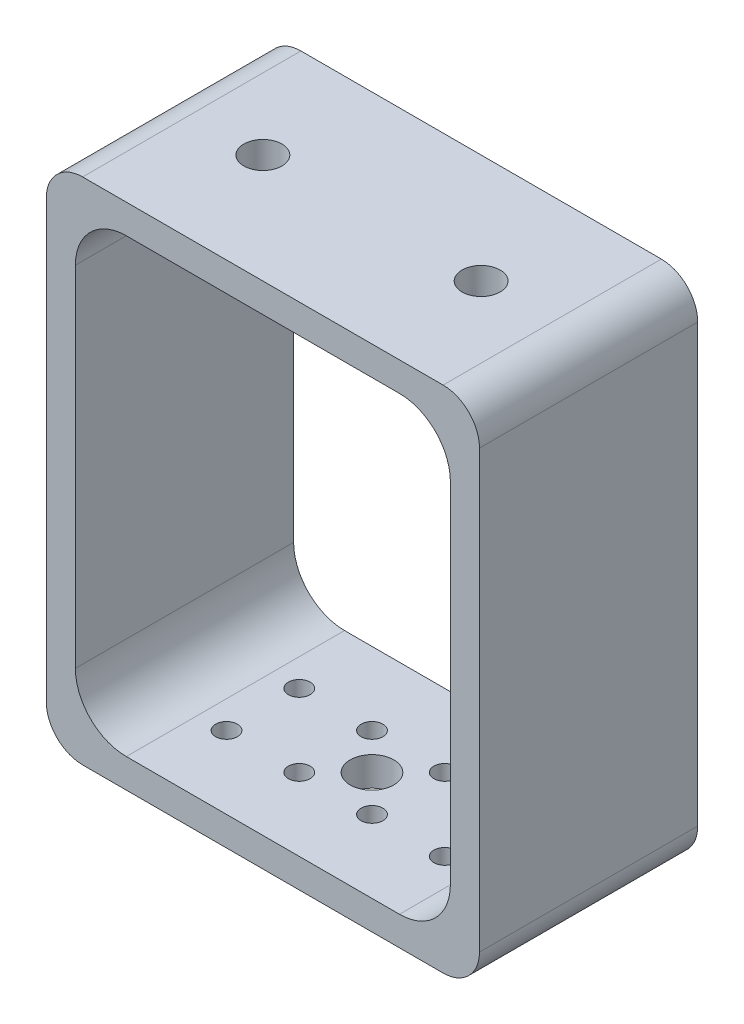
ISO-10303-21;
HEADER;
FILE_DESCRIPTION(('STEP AP214'),'2;1');
FILE_NAME('part.step','',(''),(''),'','','');
FILE_SCHEMA(('AUTOMOTIVE_DESIGN { 1 0 10303 214 1 1 1 1 }'));
ENDSEC;
DATA;
#1=APPLICATION_CONTEXT('core data for automotive mechanical design processes');
#2=APPLICATION_PROTOCOL_DEFINITION('international standard','automotive_design',2000,#1);
#3=PRODUCT_CONTEXT('',#1,'mechanical');
#4=PRODUCT('Part','Part','',(#3));
#5=PRODUCT_RELATED_PRODUCT_CATEGORY('part','',(#4));
#6=PRODUCT_DEFINITION_FORMATION('','',#4);
#7=PRODUCT_DEFINITION_CONTEXT('part definition',#1,'design');
#8=PRODUCT_DEFINITION('design','',#6,#7);
#9=PRODUCT_DEFINITION_SHAPE('','',#8);
#10=(LENGTH_UNIT() NAMED_UNIT(*) SI_UNIT(.MILLI.,.METRE.));
#11=(NAMED_UNIT(*) PLANE_ANGLE_UNIT() SI_UNIT($,.RADIAN.));
#12=(NAMED_UNIT(*) SI_UNIT($,.STERADIAN.) SOLID_ANGLE_UNIT());
#13=UNCERTAINTY_MEASURE_WITH_UNIT(LENGTH_MEASURE(1.E-05),#10,'distance_accuracy_value','');
#14=(GEOMETRIC_REPRESENTATION_CONTEXT(3) GLOBAL_UNCERTAINTY_ASSIGNED_CONTEXT((#13)) GLOBAL_UNIT_ASSIGNED_CONTEXT((#10,
#11,#12)) REPRESENTATION_CONTEXT('',''));
#15=CARTESIAN_POINT('',(0.,0.,0.));
#16=DIRECTION('',(0.,0.,1.));
#17=DIRECTION('',(1.,0.,0.));
#18=AXIS2_PLACEMENT_3D('',#15,#16,#17);
#19=CARTESIAN_POINT('',(0.,0.,15.));
#20=DIRECTION('',(0.,0.,1.));
#21=DIRECTION('',(1.,0.,0.));
#22=AXIS2_PLACEMENT_3D('',#19,#20,#21);
#23=PLANE('',#22);
#24=DIRECTION('',(0.,-1.,0.));
#25=VECTOR('',#24,1.);
#26=CARTESIAN_POINT('',(-29.7740385147519,0.,15.));
#27=LINE('',#26,#25);
#28=CARTESIAN_POINT('',(-29.7740385147519,65.,15.));
#29=VERTEX_POINT('',#28);
#30=CARTESIAN_POINT('',(-29.7740385147519,4.99999999999999,15.));
#31=VERTEX_POINT('',#30);
#32=EDGE_CURVE('E203',#29,#31,#27,.T.);
#33=ORIENTED_EDGE('',*,*,#32,.T.);
#34=CARTESIAN_POINT('',(-24.7740385147519,4.99999999999999,15.));
#35=DIRECTION('',(0.,0.,1.));
#36=DIRECTION('',(1.,0.,0.));
#37=AXIS2_PLACEMENT_3D('',#34,#35,#36);
#38=CIRCLE('',#37,5.);
#39=CARTESIAN_POINT('',(-24.7740385147519,0.,15.));
#40=VERTEX_POINT('',#39);
#41=EDGE_CURVE('E262',#31,#40,#38,.T.);
#42=ORIENTED_EDGE('',*,*,#41,.T.);
#43=DIRECTION('',(1.,0.,0.));
#44=VECTOR('',#43,1.);
#45=CARTESIAN_POINT('',(-29.7740385147519,0.,15.));
#46=LINE('',#45,#44);
#47=CARTESIAN_POINT('',(24.7740385147519,0.,15.));
#48=VERTEX_POINT('',#47);
#49=EDGE_CURVE('E291',#40,#48,#46,.T.);
#50=ORIENTED_EDGE('',*,*,#49,.T.);
#51=CARTESIAN_POINT('',(24.7740385147519,5.,15.));
#52=DIRECTION('',(0.,0.,1.));
#53=DIRECTION('',(1.,0.,0.));
#54=AXIS2_PLACEMENT_3D('',#51,#52,#53);
#55=CIRCLE('',#54,5.);
#56=CARTESIAN_POINT('',(29.7740385147519,5.,15.));
#57=VERTEX_POINT('',#56);
#58=EDGE_CURVE('E260',#48,#57,#55,.T.);
#59=ORIENTED_EDGE('',*,*,#58,.T.);
#60=DIRECTION('',(0.,1.,0.));
#61=VECTOR('',#60,1.);
#62=CARTESIAN_POINT('',(29.7740385147519,0.,15.));
#63=LINE('',#62,#61);
#64=CARTESIAN_POINT('',(29.7740385147519,65.,15.));
#65=VERTEX_POINT('',#64);
#66=EDGE_CURVE('E276',#57,#65,#63,.T.);
#67=ORIENTED_EDGE('',*,*,#66,.T.);
#68=CARTESIAN_POINT('',(24.7740385147519,65.,15.));
#69=DIRECTION('',(0.,0.,1.));
#70=DIRECTION('',(1.,0.,0.));
#71=AXIS2_PLACEMENT_3D('',#68,#69,#70);
#72=CIRCLE('',#71,5.);
#73=CARTESIAN_POINT('',(24.7740385147519,70.,15.));
#74=VERTEX_POINT('',#73);
#75=EDGE_CURVE('E84',#65,#74,#72,.T.);
#76=ORIENTED_EDGE('',*,*,#75,.T.);
#77=DIRECTION('',(-1.,0.,0.));
#78=VECTOR('',#77,1.);
#79=CARTESIAN_POINT('',(29.7740385147519,70.,15.));
#80=LINE('',#79,#78);
#81=CARTESIAN_POINT('',(-24.7740385147519,70.,15.));
#82=VERTEX_POINT('',#81);
#83=EDGE_CURVE('E208',#74,#82,#80,.T.);
#84=ORIENTED_EDGE('',*,*,#83,.T.);
#85=CARTESIAN_POINT('',(-24.7740385147519,65.,15.));
#86=DIRECTION('',(0.,0.,1.));
#87=DIRECTION('',(1.,0.,0.));
#88=AXIS2_PLACEMENT_3D('',#85,#86,#87);
#89=CIRCLE('',#88,5.);
#90=EDGE_CURVE('E257',#82,#29,#89,.T.);
#91=ORIENTED_EDGE('',*,*,#90,.T.);
#92=EDGE_LOOP('',(#33,#42,#50,#59,#67,#76,#84,#91));
#93=FACE_BOUND('',#92,.T.);
#94=DIRECTION('',(0.,1.,0.));
#95=VECTOR('',#94,1.);
#96=CARTESIAN_POINT('',(25.7740385147519,0.,15.));
#97=LINE('',#96,#95);
#98=CARTESIAN_POINT('',(25.7740385147519,11.,15.));
#99=VERTEX_POINT('',#98);
#100=CARTESIAN_POINT('',(25.7740385147519,59.,15.));
#101=VERTEX_POINT('',#100);
#102=EDGE_CURVE('E306',#99,#101,#97,.T.);
#103=ORIENTED_EDGE('',*,*,#102,.F.);
#104=CARTESIAN_POINT('',(18.7740385147519,11.,15.));
#105=DIRECTION('',(0.,0.,1.));
#106=DIRECTION('',(1.,0.,0.));
#107=AXIS2_PLACEMENT_3D('',#104,#105,#106);
#108=CIRCLE('',#107,7.);
#109=CARTESIAN_POINT('',(18.7740385147519,4.,15.));
#110=VERTEX_POINT('',#109);
#111=EDGE_CURVE('E188',#99,#110,#108,.F.);
#112=ORIENTED_EDGE('',*,*,#111,.T.);
#113=DIRECTION('',(1.,0.,0.));
#114=VECTOR('',#113,1.);
#115=CARTESIAN_POINT('',(-29.7740385147519,3.99999999999999,15.));
#116=LINE('',#115,#114);
#117=CARTESIAN_POINT('',(-18.7740385147519,3.99999999999999,15.));
#118=VERTEX_POINT('',#117);
#119=EDGE_CURVE('E295',#118,#110,#116,.T.);
#120=ORIENTED_EDGE('',*,*,#119,.F.);
#121=CARTESIAN_POINT('',(-18.7740385147519,11.,15.));
#122=DIRECTION('',(0.,0.,1.));
#123=DIRECTION('',(1.,0.,0.));
#124=AXIS2_PLACEMENT_3D('',#121,#122,#123);
#125=CIRCLE('',#124,7.);
#126=CARTESIAN_POINT('',(-25.7740385147519,11.,15.));
#127=VERTEX_POINT('',#126);
#128=EDGE_CURVE('E187',#118,#127,#125,.F.);
#129=ORIENTED_EDGE('',*,*,#128,.T.);
#130=DIRECTION('',(0.,-1.,0.));
#131=VECTOR('',#130,1.);
#132=CARTESIAN_POINT('',(-25.7740385147519,0.,15.));
#133=LINE('',#132,#131);
#134=CARTESIAN_POINT('',(-25.7740385147519,59.,15.));
#135=VERTEX_POINT('',#134);
#136=EDGE_CURVE('E286',#135,#127,#133,.T.);
#137=ORIENTED_EDGE('',*,*,#136,.F.);
#138=CARTESIAN_POINT('',(-18.7740385147519,59.,15.));
#139=DIRECTION('',(0.,0.,1.));
#140=DIRECTION('',(1.,0.,0.));
#141=AXIS2_PLACEMENT_3D('',#138,#139,#140);
#142=CIRCLE('',#141,7.);
#143=CARTESIAN_POINT('',(-18.7740385147519,66.,15.));
#144=VERTEX_POINT('',#143);
#145=EDGE_CURVE('E237',#135,#144,#142,.F.);
#146=ORIENTED_EDGE('',*,*,#145,.T.);
#147=DIRECTION('',(-1.,0.,0.));
#148=VECTOR('',#147,1.);
#149=CARTESIAN_POINT('',(29.7740385147519,66.,15.));
#150=LINE('',#149,#148);
#151=CARTESIAN_POINT('',(18.7740385147519,66.,15.));
#152=VERTEX_POINT('',#151);
#153=EDGE_CURVE('E303',#152,#144,#150,.T.);
#154=ORIENTED_EDGE('',*,*,#153,.F.);
#155=CARTESIAN_POINT('',(18.7740385147519,59.,15.));
#156=DIRECTION('',(0.,0.,1.));
#157=DIRECTION('',(1.,0.,0.));
#158=AXIS2_PLACEMENT_3D('',#155,#156,#157);
#159=CIRCLE('',#158,7.);
#160=EDGE_CURVE('E233',#152,#101,#159,.F.);
#161=ORIENTED_EDGE('',*,*,#160,.T.);
#162=EDGE_LOOP('',(#103,#112,#120,#129,#137,#146,#154,#161));
#163=FACE_BOUND('',#162,.T.);
#164=ADVANCED_FACE('F63',(#93,#163),#23,.T.);
#165=CARTESIAN_POINT('',(0.,0.,-15.));
#166=DIRECTION('',(0.,0.,1.));
#167=DIRECTION('',(1.,0.,0.));
#168=AXIS2_PLACEMENT_3D('',#165,#166,#167);
#169=PLANE('',#168);
#170=DIRECTION('',(1.,0.,0.));
#171=VECTOR('',#170,1.);
#172=CARTESIAN_POINT('',(-29.7740385147519,0.,-15.));
#173=LINE('',#172,#171);
#174=CARTESIAN_POINT('',(-24.7740385147519,0.,-15.));
#175=VERTEX_POINT('',#174);
#176=CARTESIAN_POINT('',(24.7740385147519,0.,-15.));
#177=VERTEX_POINT('',#176);
#178=EDGE_CURVE('E284',#175,#177,#173,.T.);
#179=ORIENTED_EDGE('',*,*,#178,.F.);
#180=CARTESIAN_POINT('',(-24.7740385147519,4.99999999999999,-15.));
#181=DIRECTION('',(0.,0.,1.));
#182=DIRECTION('',(1.,0.,0.));
#183=AXIS2_PLACEMENT_3D('',#180,#181,#182);
#184=CIRCLE('',#183,5.);
#185=CARTESIAN_POINT('',(-29.7740385147519,4.99999999999999,-15.));
#186=VERTEX_POINT('',#185);
#187=EDGE_CURVE('E250',#175,#186,#184,.F.);
#188=ORIENTED_EDGE('',*,*,#187,.T.);
#189=DIRECTION('',(0.,-1.,0.));
#190=VECTOR('',#189,1.);
#191=CARTESIAN_POINT('',(-29.7740385147519,0.,-15.));
#192=LINE('',#191,#190);
#193=CARTESIAN_POINT('',(-29.7740385147519,65.,-15.));
#194=VERTEX_POINT('',#193);
#195=EDGE_CURVE('E211',#194,#186,#192,.T.);
#196=ORIENTED_EDGE('',*,*,#195,.F.);
#197=CARTESIAN_POINT('',(-24.7740385147519,65.,-15.));
#198=DIRECTION('',(0.,0.,1.));
#199=DIRECTION('',(1.,0.,0.));
#200=AXIS2_PLACEMENT_3D('',#197,#198,#199);
#201=CIRCLE('',#200,5.);
#202=CARTESIAN_POINT('',(-24.7740385147519,70.,-15.));
#203=VERTEX_POINT('',#202);
#204=EDGE_CURVE('E244',#194,#203,#201,.F.);
#205=ORIENTED_EDGE('',*,*,#204,.T.);
#206=DIRECTION('',(-1.,0.,0.));
#207=VECTOR('',#206,1.);
#208=CARTESIAN_POINT('',(-29.7740385147519,70.,-15.));
#209=LINE('',#208,#207);
#210=CARTESIAN_POINT('',(24.7740385147519,70.,-15.));
#211=VERTEX_POINT('',#210);
#212=EDGE_CURVE('E283',#211,#203,#209,.T.);
#213=ORIENTED_EDGE('',*,*,#212,.F.);
#214=CARTESIAN_POINT('',(24.7740385147519,65.,-15.));
#215=DIRECTION('',(0.,0.,1.));
#216=DIRECTION('',(1.,0.,0.));
#217=AXIS2_PLACEMENT_3D('',#214,#215,#216);
#218=CIRCLE('',#217,5.);
#219=CARTESIAN_POINT('',(29.7740385147519,65.,-15.));
#220=VERTEX_POINT('',#219);
#221=EDGE_CURVE('E246',#211,#220,#218,.F.);
#222=ORIENTED_EDGE('',*,*,#221,.T.);
#223=DIRECTION('',(0.,1.,0.));
#224=VECTOR('',#223,1.);
#225=CARTESIAN_POINT('',(29.7740385147519,0.,-15.));
#226=LINE('',#225,#224);
#227=CARTESIAN_POINT('',(29.7740385147519,5.,-15.));
#228=VERTEX_POINT('',#227);
#229=EDGE_CURVE('E274',#228,#220,#226,.T.);
#230=ORIENTED_EDGE('',*,*,#229,.F.);
#231=CARTESIAN_POINT('',(24.7740385147519,5.,-15.));
#232=DIRECTION('',(0.,0.,1.));
#233=DIRECTION('',(1.,0.,0.));
#234=AXIS2_PLACEMENT_3D('',#231,#232,#233);
#235=CIRCLE('',#234,5.);
#236=EDGE_CURVE('E248',#228,#177,#235,.F.);
#237=ORIENTED_EDGE('',*,*,#236,.T.);
#238=EDGE_LOOP('',(#179,#188,#196,#205,#213,#222,#230,#237));
#239=FACE_BOUND('',#238,.T.);
#240=DIRECTION('',(0.,-1.,0.));
#241=VECTOR('',#240,1.);
#242=CARTESIAN_POINT('',(-25.7740385147519,0.,-15.));
#243=LINE('',#242,#241);
#244=CARTESIAN_POINT('',(-25.7740385147519,59.,-15.));
#245=VERTEX_POINT('',#244);
#246=CARTESIAN_POINT('',(-25.7740385147519,11.,-15.));
#247=VERTEX_POINT('',#246);
#248=EDGE_CURVE('E182',#245,#247,#243,.T.);
#249=ORIENTED_EDGE('',*,*,#248,.T.);
#250=CARTESIAN_POINT('',(-18.7740385147519,11.,-15.));
#251=DIRECTION('',(0.,0.,1.));
#252=DIRECTION('',(1.,0.,0.));
#253=AXIS2_PLACEMENT_3D('',#250,#251,#252);
#254=CIRCLE('',#253,7.);
#255=CARTESIAN_POINT('',(-18.7740385147519,3.99999999999999,-15.));
#256=VERTEX_POINT('',#255);
#257=EDGE_CURVE('E177',#247,#256,#254,.T.);
#258=ORIENTED_EDGE('',*,*,#257,.T.);
#259=DIRECTION('',(1.,0.,0.));
#260=VECTOR('',#259,1.);
#261=CARTESIAN_POINT('',(-29.7740385147519,3.99999999999999,-15.));
#262=LINE('',#261,#260);
#263=CARTESIAN_POINT('',(18.7740385147519,4.,-15.));
#264=VERTEX_POINT('',#263);
#265=EDGE_CURVE('E180',#256,#264,#262,.T.);
#266=ORIENTED_EDGE('',*,*,#265,.T.);
#267=CARTESIAN_POINT('',(18.7740385147519,11.,-15.));
#268=DIRECTION('',(0.,0.,1.));
#269=DIRECTION('',(1.,0.,0.));
#270=AXIS2_PLACEMENT_3D('',#267,#268,#269);
#271=CIRCLE('',#270,7.);
#272=CARTESIAN_POINT('',(25.7740385147519,11.,-15.));
#273=VERTEX_POINT('',#272);
#274=EDGE_CURVE('E227',#264,#273,#271,.T.);
#275=ORIENTED_EDGE('',*,*,#274,.T.);
#276=DIRECTION('',(0.,1.,0.));
#277=VECTOR('',#276,1.);
#278=CARTESIAN_POINT('',(25.7740385147519,0.,-15.));
#279=LINE('',#278,#277);
#280=CARTESIAN_POINT('',(25.7740385147519,59.,-15.));
#281=VERTEX_POINT('',#280);
#282=EDGE_CURVE('E198',#273,#281,#279,.T.);
#283=ORIENTED_EDGE('',*,*,#282,.T.);
#284=CARTESIAN_POINT('',(18.7740385147519,59.,-15.));
#285=DIRECTION('',(0.,0.,1.));
#286=DIRECTION('',(1.,0.,0.));
#287=AXIS2_PLACEMENT_3D('',#284,#285,#286);
#288=CIRCLE('',#287,7.);
#289=CARTESIAN_POINT('',(18.7740385147519,66.,-15.));
#290=VERTEX_POINT('',#289);
#291=EDGE_CURVE('E231',#281,#290,#288,.T.);
#292=ORIENTED_EDGE('',*,*,#291,.T.);
#293=DIRECTION('',(-1.,0.,0.));
#294=VECTOR('',#293,1.);
#295=CARTESIAN_POINT('',(-29.7740385147519,66.,-15.));
#296=LINE('',#295,#294);
#297=CARTESIAN_POINT('',(-18.7740385147519,66.,-15.));
#298=VERTEX_POINT('',#297);
#299=EDGE_CURVE('E296',#290,#298,#296,.T.);
#300=ORIENTED_EDGE('',*,*,#299,.T.);
#301=CARTESIAN_POINT('',(-18.7740385147519,59.,-15.));
#302=DIRECTION('',(0.,0.,1.));
#303=DIRECTION('',(1.,0.,0.));
#304=AXIS2_PLACEMENT_3D('',#301,#302,#303);
#305=CIRCLE('',#304,7.);
#306=EDGE_CURVE('E235',#298,#245,#305,.T.);
#307=ORIENTED_EDGE('',*,*,#306,.T.);
#308=EDGE_LOOP('',(#249,#258,#266,#275,#283,#292,#300,#307));
#309=FACE_BOUND('',#308,.T.);
#310=ADVANCED_FACE('F179',(#239,#309),#169,.F.);
#311=CARTESIAN_POINT('',(-29.7740385147519,0.,15.));
#312=DIRECTION('',(0.,1.,0.));
#313=DIRECTION('',(-1.,0.,0.));
#314=AXIS2_PLACEMENT_3D('',#311,#312,#313);
#315=PLANE('',#314);
#316=CARTESIAN_POINT('',(-15.,0.,-5.));
#317=DIRECTION('',(0.,1.,0.));
#318=DIRECTION('',(0.,0.,1.));
#319=AXIS2_PLACEMENT_3D('',#316,#317,#318);
#320=CIRCLE('',#319,1.5);
#321=CARTESIAN_POINT('',(-15.,0.,-3.5));
#322=VERTEX_POINT('',#321);
#323=EDGE_CURVE('E368',#322,#322,#320,.T.);
#324=ORIENTED_EDGE('',*,*,#323,.T.);
#325=EDGE_LOOP('',(#324));
#326=FACE_BOUND('',#325,.T.);
#327=CARTESIAN_POINT('',(-5.,0.,-5.));
#328=DIRECTION('',(0.,1.,0.));
#329=DIRECTION('',(0.,0.,1.));
#330=AXIS2_PLACEMENT_3D('',#327,#328,#329);
#331=CIRCLE('',#330,1.5);
#332=CARTESIAN_POINT('',(-5.,0.,-3.5));
#333=VERTEX_POINT('',#332);
#334=EDGE_CURVE('E362',#333,#333,#331,.T.);
#335=ORIENTED_EDGE('',*,*,#334,.T.);
#336=EDGE_LOOP('',(#335));
#337=FACE_BOUND('',#336,.T.);
#338=CARTESIAN_POINT('',(5.,0.,-5.));
#339=DIRECTION('',(0.,1.,0.));
#340=DIRECTION('',(0.,0.,1.));
#341=AXIS2_PLACEMENT_3D('',#338,#339,#340);
#342=CIRCLE('',#341,1.5);
#343=CARTESIAN_POINT('',(5.,0.,-3.5));
#344=VERTEX_POINT('',#343);
#345=EDGE_CURVE('E356',#344,#344,#342,.T.);
#346=ORIENTED_EDGE('',*,*,#345,.T.);
#347=EDGE_LOOP('',(#346));
#348=FACE_BOUND('',#347,.T.);
#349=CARTESIAN_POINT('',(15.,0.,-5.));
#350=DIRECTION('',(0.,1.,0.));
#351=DIRECTION('',(0.,0.,1.));
#352=AXIS2_PLACEMENT_3D('',#349,#350,#351);
#353=CIRCLE('',#352,1.5);
#354=CARTESIAN_POINT('',(15.,0.,-3.5));
#355=VERTEX_POINT('',#354);
#356=EDGE_CURVE('E339',#355,#355,#353,.T.);
#357=ORIENTED_EDGE('',*,*,#356,.T.);
#358=EDGE_LOOP('',(#357));
#359=FACE_BOUND('',#358,.T.);
#360=CARTESIAN_POINT('',(-14.9999999999999,0.,5.));
#361=DIRECTION('',(0.,1.,0.));
#362=DIRECTION('',(0.,0.,1.));
#363=AXIS2_PLACEMENT_3D('',#360,#361,#362);
#364=CIRCLE('',#363,1.5);
#365=CARTESIAN_POINT('',(-14.9999999999999,0.,6.5));
#366=VERTEX_POINT('',#365);
#367=EDGE_CURVE('E346',#366,#366,#364,.T.);
#368=ORIENTED_EDGE('',*,*,#367,.T.);
#369=EDGE_LOOP('',(#368));
#370=FACE_BOUND('',#369,.T.);
#371=CARTESIAN_POINT('',(15.0000000000001,0.,5.));
#372=DIRECTION('',(0.,1.,0.));
#373=DIRECTION('',(0.,0.,1.));
#374=AXIS2_PLACEMENT_3D('',#371,#372,#373);
#375=CIRCLE('',#374,1.5);
#376=CARTESIAN_POINT('',(15.0000000000001,0.,6.5));
#377=VERTEX_POINT('',#376);
#378=EDGE_CURVE('E345',#377,#377,#375,.T.);
#379=ORIENTED_EDGE('',*,*,#378,.T.);
#380=EDGE_LOOP('',(#379));
#381=FACE_BOUND('',#380,.T.);
#382=CARTESIAN_POINT('',(5.0000000000001,0.,5.));
#383=DIRECTION('',(0.,1.,0.));
#384=DIRECTION('',(0.,0.,1.));
#385=AXIS2_PLACEMENT_3D('',#382,#383,#384);
#386=CIRCLE('',#385,1.5);
#387=CARTESIAN_POINT('',(5.0000000000001,0.,6.5));
#388=VERTEX_POINT('',#387);
#389=EDGE_CURVE('E332',#388,#388,#386,.T.);
#390=ORIENTED_EDGE('',*,*,#389,.T.);
#391=EDGE_LOOP('',(#390));
#392=FACE_BOUND('',#391,.T.);
#393=CARTESIAN_POINT('',(-4.9999999999999,0.,5.));
#394=DIRECTION('',(0.,1.,0.));
#395=DIRECTION('',(0.,0.,1.));
#396=AXIS2_PLACEMENT_3D('',#393,#394,#395);
#397=CIRCLE('',#396,1.5);
#398=CARTESIAN_POINT('',(-4.9999999999999,0.,6.5));
#399=VERTEX_POINT('',#398);
#400=EDGE_CURVE('E331',#399,#399,#397,.T.);
#401=ORIENTED_EDGE('',*,*,#400,.T.);
#402=EDGE_LOOP('',(#401));
#403=FACE_BOUND('',#402,.T.);
#404=CARTESIAN_POINT('',(0.,0.,0.));
#405=DIRECTION('',(0.,1.,0.));
#406=DIRECTION('',(0.,0.,1.));
#407=AXIS2_PLACEMENT_3D('',#404,#405,#406);
#408=CIRCLE('',#407,3.);
#409=CARTESIAN_POINT('',(0.,0.,3.));
#410=VERTEX_POINT('',#409);
#411=EDGE_CURVE('E324',#410,#410,#408,.T.);
#412=ORIENTED_EDGE('',*,*,#411,.T.);
#413=EDGE_LOOP('',(#412));
#414=FACE_BOUND('',#413,.T.);
#415=ORIENTED_EDGE('',*,*,#49,.F.);
#416=DIRECTION('',(0.,0.,-1.));
#417=VECTOR('',#416,1.);
#418=CARTESIAN_POINT('',(-24.7740385147519,0.,15.));
#419=LINE('',#418,#417);
#420=EDGE_CURVE('E241',#40,#175,#419,.T.);
#421=ORIENTED_EDGE('',*,*,#420,.T.);
#422=ORIENTED_EDGE('',*,*,#178,.T.);
#423=DIRECTION('',(0.,0.,-1.));
#424=VECTOR('',#423,1.);
#425=CARTESIAN_POINT('',(24.7740385147519,0.,15.));
#426=LINE('',#425,#424);
#427=EDGE_CURVE('E239',#177,#48,#426,.F.);
#428=ORIENTED_EDGE('',*,*,#427,.T.);
#429=EDGE_LOOP('',(#415,#421,#422,#428));
#430=FACE_BOUND('',#429,.T.);
#431=ADVANCED_FACE('F376',(#326,#337,#348,#359,#370,#381,#392,#403,#414,#430),#315,.F.);
#432=CARTESIAN_POINT('',(29.7740385147519,0.,15.));
#433=DIRECTION('',(-1.,0.,0.));
#434=DIRECTION('',(0.,0.,1.));
#435=AXIS2_PLACEMENT_3D('',#432,#433,#434);
#436=PLANE('',#435);
#437=ORIENTED_EDGE('',*,*,#66,.F.);
#438=DIRECTION('',(0.,0.,-1.));
#439=VECTOR('',#438,1.);
#440=CARTESIAN_POINT('',(29.7740385147519,5.,15.));
#441=LINE('',#440,#439);
#442=EDGE_CURVE('E266',#57,#228,#441,.T.);
#443=ORIENTED_EDGE('',*,*,#442,.T.);
#444=ORIENTED_EDGE('',*,*,#229,.T.);
#445=DIRECTION('',(0.,0.,-1.));
#446=VECTOR('',#445,1.);
#447=CARTESIAN_POINT('',(29.7740385147519,65.,15.));
#448=LINE('',#447,#446);
#449=EDGE_CURVE('E264',#220,#65,#448,.F.);
#450=ORIENTED_EDGE('',*,*,#449,.T.);
#451=EDGE_LOOP('',(#437,#443,#444,#450));
#452=FACE_BOUND('',#451,.T.);
#453=ADVANCED_FACE('F273',(#452),#436,.F.);
#454=CARTESIAN_POINT('',(-29.7740385147519,70.,15.));
#455=DIRECTION('',(0.,-1.,0.));
#456=DIRECTION('',(1.,0.,0.));
#457=AXIS2_PLACEMENT_3D('',#454,#455,#456);
#458=PLANE('',#457);
#459=CARTESIAN_POINT('',(-15.,70.,1.04744440165294E-13));
#460=DIRECTION('',(0.,-1.,0.));
#461=DIRECTION('',(0.,0.,-1.));
#462=AXIS2_PLACEMENT_3D('',#459,#460,#461);
#463=CIRCLE('',#462,2.62067407029812);
#464=CARTESIAN_POINT('',(-15.,70.,-2.62067407029802));
#465=VERTEX_POINT('',#464);
#466=EDGE_CURVE('E313',#465,#465,#463,.T.);
#467=ORIENTED_EDGE('',*,*,#466,.T.);
#468=EDGE_LOOP('',(#467));
#469=FACE_BOUND('',#468,.T.);
#470=CARTESIAN_POINT('',(15.,70.,0.));
#471=DIRECTION('',(0.,-1.,0.));
#472=DIRECTION('',(0.,0.,-1.));
#473=AXIS2_PLACEMENT_3D('',#470,#471,#472);
#474=CIRCLE('',#473,2.62067407029812);
#475=CARTESIAN_POINT('',(15.,70.,-2.62067407029812));
#476=VERTEX_POINT('',#475);
#477=EDGE_CURVE('E199',#476,#476,#474,.T.);
#478=ORIENTED_EDGE('',*,*,#477,.T.);
#479=EDGE_LOOP('',(#478));
#480=FACE_BOUND('',#479,.T.);
#481=ORIENTED_EDGE('',*,*,#83,.F.);
#482=DIRECTION('',(0.,0.,-1.));
#483=VECTOR('',#482,1.);
#484=CARTESIAN_POINT('',(24.7740385147519,70.,15.));
#485=LINE('',#484,#483);
#486=EDGE_CURVE('E12',#74,#211,#485,.T.);
#487=ORIENTED_EDGE('',*,*,#486,.T.);
#488=ORIENTED_EDGE('',*,*,#212,.T.);
#489=DIRECTION('',(0.,0.,-1.));
#490=VECTOR('',#489,1.);
#491=CARTESIAN_POINT('',(-24.7740385147519,70.,15.));
#492=LINE('',#491,#490);
#493=EDGE_CURVE('E71',#203,#82,#492,.F.);
#494=ORIENTED_EDGE('',*,*,#493,.T.);
#495=EDGE_LOOP('',(#481,#487,#488,#494));
#496=FACE_BOUND('',#495,.T.);
#497=ADVANCED_FACE('F408',(#469,#480,#496),#458,.F.);
#498=CARTESIAN_POINT('',(-29.7740385147519,0.,15.));
#499=DIRECTION('',(1.,0.,0.));
#500=DIRECTION('',(0.,1.,0.));
#501=AXIS2_PLACEMENT_3D('',#498,#499,#500);
#502=PLANE('',#501);
#503=ORIENTED_EDGE('',*,*,#195,.T.);
#504=DIRECTION('',(0.,0.,-1.));
#505=VECTOR('',#504,1.);
#506=CARTESIAN_POINT('',(-29.7740385147519,4.99999999999999,15.));
#507=LINE('',#506,#505);
#508=EDGE_CURVE('E255',#186,#31,#507,.F.);
#509=ORIENTED_EDGE('',*,*,#508,.T.);
#510=ORIENTED_EDGE('',*,*,#32,.F.);
#511=DIRECTION('',(0.,0.,-1.));
#512=VECTOR('',#511,1.);
#513=CARTESIAN_POINT('',(-29.7740385147519,65.,15.));
#514=LINE('',#513,#512);
#515=EDGE_CURVE('E252',#29,#194,#514,.T.);
#516=ORIENTED_EDGE('',*,*,#515,.T.);
#517=EDGE_LOOP('',(#503,#509,#510,#516));
#518=FACE_BOUND('',#517,.T.);
#519=ADVANCED_FACE('F405',(#518),#502,.F.);
#520=CARTESIAN_POINT('',(-29.7740385147519,3.99999999999999,15.));
#521=DIRECTION('',(0.,1.,0.));
#522=DIRECTION('',(-1.,0.,0.));
#523=AXIS2_PLACEMENT_3D('',#520,#521,#522);
#524=PLANE('',#523);
#525=CARTESIAN_POINT('',(-15.,3.99999999999999,-5.));
#526=DIRECTION('',(0.,1.,0.));
#527=DIRECTION('',(-1.,0.,0.));
#528=AXIS2_PLACEMENT_3D('',#525,#526,#527);
#529=CIRCLE('',#528,1.5);
#530=CARTESIAN_POINT('',(-16.5,3.99999999999999,-5.));
#531=VERTEX_POINT('',#530);
#532=EDGE_CURVE('E327',#531,#531,#529,.T.);
#533=ORIENTED_EDGE('',*,*,#532,.F.);
#534=EDGE_LOOP('',(#533));
#535=FACE_BOUND('',#534,.T.);
#536=CARTESIAN_POINT('',(-5.,3.99999999999999,-5.));
#537=DIRECTION('',(0.,1.,0.));
#538=DIRECTION('',(-1.,0.,0.));
#539=AXIS2_PLACEMENT_3D('',#536,#537,#538);
#540=CIRCLE('',#539,1.5);
#541=CARTESIAN_POINT('',(-6.5,3.99999999999999,-5.));
#542=VERTEX_POINT('',#541);
#543=EDGE_CURVE('E365',#542,#542,#540,.T.);
#544=ORIENTED_EDGE('',*,*,#543,.F.);
#545=EDGE_LOOP('',(#544));
#546=FACE_BOUND('',#545,.T.);
#547=CARTESIAN_POINT('',(5.,3.99999999999999,-5.));
#548=DIRECTION('',(0.,1.,0.));
#549=DIRECTION('',(-1.,0.,0.));
#550=AXIS2_PLACEMENT_3D('',#547,#548,#549);
#551=CIRCLE('',#550,1.5);
#552=CARTESIAN_POINT('',(3.5,3.99999999999999,-5.));
#553=VERTEX_POINT('',#552);
#554=EDGE_CURVE('E359',#553,#553,#551,.T.);
#555=ORIENTED_EDGE('',*,*,#554,.F.);
#556=EDGE_LOOP('',(#555));
#557=FACE_BOUND('',#556,.T.);
#558=CARTESIAN_POINT('',(15.,4.,-5.));
#559=DIRECTION('',(0.,1.,0.));
#560=DIRECTION('',(-1.,0.,0.));
#561=AXIS2_PLACEMENT_3D('',#558,#559,#560);
#562=CIRCLE('',#561,1.5);
#563=CARTESIAN_POINT('',(13.5,4.,-5.));
#564=VERTEX_POINT('',#563);
#565=EDGE_CURVE('E353',#564,#564,#562,.T.);
#566=ORIENTED_EDGE('',*,*,#565,.F.);
#567=EDGE_LOOP('',(#566));
#568=FACE_BOUND('',#567,.T.);
#569=CARTESIAN_POINT('',(-14.9999999999999,3.99999999999999,5.));
#570=DIRECTION('',(0.,1.,0.));
#571=DIRECTION('',(-1.,0.,0.));
#572=AXIS2_PLACEMENT_3D('',#569,#570,#571);
#573=CIRCLE('',#572,1.5);
#574=CARTESIAN_POINT('',(-16.4999999999999,3.99999999999999,5.));
#575=VERTEX_POINT('',#574);
#576=EDGE_CURVE('E342',#575,#575,#573,.T.);
#577=ORIENTED_EDGE('',*,*,#576,.F.);
#578=EDGE_LOOP('',(#577));
#579=FACE_BOUND('',#578,.T.);
#580=CARTESIAN_POINT('',(15.0000000000001,4.,5.));
#581=DIRECTION('',(0.,1.,0.));
#582=DIRECTION('',(-1.,0.,0.));
#583=AXIS2_PLACEMENT_3D('',#580,#581,#582);
#584=CIRCLE('',#583,1.5);
#585=CARTESIAN_POINT('',(13.5000000000001,4.,5.));
#586=VERTEX_POINT('',#585);
#587=EDGE_CURVE('E335',#586,#586,#584,.T.);
#588=ORIENTED_EDGE('',*,*,#587,.F.);
#589=EDGE_LOOP('',(#588));
#590=FACE_BOUND('',#589,.T.);
#591=CARTESIAN_POINT('',(5.0000000000001,3.99999999999999,5.));
#592=DIRECTION('',(0.,1.,0.));
#593=DIRECTION('',(-1.,0.,0.));
#594=AXIS2_PLACEMENT_3D('',#591,#592,#593);
#595=CIRCLE('',#594,1.5);
#596=CARTESIAN_POINT('',(3.5000000000001,3.99999999999999,5.));
#597=VERTEX_POINT('',#596);
#598=EDGE_CURVE('E328',#597,#597,#595,.T.);
#599=ORIENTED_EDGE('',*,*,#598,.F.);
#600=EDGE_LOOP('',(#599));
#601=FACE_BOUND('',#600,.T.);
#602=CARTESIAN_POINT('',(-4.9999999999999,3.99999999999999,5.));
#603=DIRECTION('',(0.,1.,0.));
#604=DIRECTION('',(-1.,0.,0.));
#605=AXIS2_PLACEMENT_3D('',#602,#603,#604);
#606=CIRCLE('',#605,1.5);
#607=CARTESIAN_POINT('',(-6.4999999999999,3.99999999999999,5.));
#608=VERTEX_POINT('',#607);
#609=EDGE_CURVE('E336',#608,#608,#606,.T.);
#610=ORIENTED_EDGE('',*,*,#609,.F.);
#611=EDGE_LOOP('',(#610));
#612=FACE_BOUND('',#611,.T.);
#613=CARTESIAN_POINT('',(0.,3.99999999999999,0.));
#614=DIRECTION('',(0.,1.,0.));
#615=DIRECTION('',(-1.,0.,0.));
#616=AXIS2_PLACEMENT_3D('',#613,#614,#615);
#617=CIRCLE('',#616,3.);
#618=CARTESIAN_POINT('',(-3.,3.99999999999999,0.));
#619=VERTEX_POINT('',#618);
#620=EDGE_CURVE('E319',#619,#619,#617,.T.);
#621=ORIENTED_EDGE('',*,*,#620,.F.);
#622=EDGE_LOOP('',(#621));
#623=FACE_BOUND('',#622,.T.);
#624=ORIENTED_EDGE('',*,*,#119,.T.);
#625=DIRECTION('',(0.,0.,-1.));
#626=VECTOR('',#625,1.);
#627=CARTESIAN_POINT('',(18.7740385147519,4.,-15.));
#628=LINE('',#627,#626);
#629=EDGE_CURVE('E197',#110,#264,#628,.T.);
#630=ORIENTED_EDGE('',*,*,#629,.T.);
#631=ORIENTED_EDGE('',*,*,#265,.F.);
#632=DIRECTION('',(0.,0.,-1.));
#633=VECTOR('',#632,1.);
#634=CARTESIAN_POINT('',(-18.7740385147519,3.99999999999999,15.));
#635=LINE('',#634,#633);
#636=EDGE_CURVE('E194',#256,#118,#635,.F.);
#637=ORIENTED_EDGE('',*,*,#636,.T.);
#638=EDGE_LOOP('',(#624,#630,#631,#637));
#639=FACE_BOUND('',#638,.T.);
#640=ADVANCED_FACE('F193',(#535,#546,#557,#568,#579,#590,#601,#612,#623,#639),#524,.T.);
#641=CARTESIAN_POINT('',(25.7740385147519,0.,15.));
#642=DIRECTION('',(-1.,0.,0.));
#643=DIRECTION('',(0.,0.,1.));
#644=AXIS2_PLACEMENT_3D('',#641,#642,#643);
#645=PLANE('',#644);
#646=ORIENTED_EDGE('',*,*,#282,.F.);
#647=DIRECTION('',(0.,0.,-1.));
#648=VECTOR('',#647,1.);
#649=CARTESIAN_POINT('',(25.7740385147519,11.,15.));
#650=LINE('',#649,#648);
#651=EDGE_CURVE('E216',#273,#99,#650,.F.);
#652=ORIENTED_EDGE('',*,*,#651,.T.);
#653=ORIENTED_EDGE('',*,*,#102,.T.);
#654=DIRECTION('',(0.,0.,-1.));
#655=VECTOR('',#654,1.);
#656=CARTESIAN_POINT('',(25.7740385147519,59.,-15.));
#657=LINE('',#656,#655);
#658=EDGE_CURVE('E205',#101,#281,#657,.T.);
#659=ORIENTED_EDGE('',*,*,#658,.T.);
#660=EDGE_LOOP('',(#646,#652,#653,#659));
#661=FACE_BOUND('',#660,.T.);
#662=ADVANCED_FACE('F594',(#661),#645,.T.);
#663=CARTESIAN_POINT('',(-29.7740385147519,66.,15.));
#664=DIRECTION('',(0.,-1.,0.));
#665=DIRECTION('',(1.,0.,0.));
#666=AXIS2_PLACEMENT_3D('',#663,#664,#665);
#667=PLANE('',#666);
#668=CARTESIAN_POINT('',(-15.,66.,1.04744440165294E-13));
#669=DIRECTION('',(0.,-1.,0.));
#670=DIRECTION('',(0.,0.,-1.));
#671=AXIS2_PLACEMENT_3D('',#668,#669,#670);
#672=CIRCLE('',#671,2.62067407029812);
#673=CARTESIAN_POINT('',(-15.,66.,-2.62067407029802));
#674=VERTEX_POINT('',#673);
#675=EDGE_CURVE('E316',#674,#674,#672,.T.);
#676=ORIENTED_EDGE('',*,*,#675,.F.);
#677=EDGE_LOOP('',(#676));
#678=FACE_BOUND('',#677,.T.);
#679=CARTESIAN_POINT('',(15.,66.,0.));
#680=DIRECTION('',(0.,-1.,0.));
#681=DIRECTION('',(0.,0.,-1.));
#682=AXIS2_PLACEMENT_3D('',#679,#680,#681);
#683=CIRCLE('',#682,2.62067407029812);
#684=CARTESIAN_POINT('',(15.,66.,-2.62067407029812));
#685=VERTEX_POINT('',#684);
#686=EDGE_CURVE('E310',#685,#685,#683,.T.);
#687=ORIENTED_EDGE('',*,*,#686,.F.);
#688=EDGE_LOOP('',(#687));
#689=FACE_BOUND('',#688,.T.);
#690=ORIENTED_EDGE('',*,*,#299,.F.);
#691=DIRECTION('',(0.,0.,-1.));
#692=VECTOR('',#691,1.);
#693=CARTESIAN_POINT('',(18.7740385147519,66.,15.));
#694=LINE('',#693,#692);
#695=EDGE_CURVE('E225',#290,#152,#694,.F.);
#696=ORIENTED_EDGE('',*,*,#695,.T.);
#697=ORIENTED_EDGE('',*,*,#153,.T.);
#698=DIRECTION('',(0.,0.,-1.));
#699=VECTOR('',#698,1.);
#700=CARTESIAN_POINT('',(-18.7740385147519,66.,-15.));
#701=LINE('',#700,#699);
#702=EDGE_CURVE('E222',#144,#298,#701,.T.);
#703=ORIENTED_EDGE('',*,*,#702,.T.);
#704=EDGE_LOOP('',(#690,#696,#697,#703));
#705=FACE_BOUND('',#704,.T.);
#706=ADVANCED_FACE('F632',(#678,#689,#705),#667,.T.);
#707=CARTESIAN_POINT('',(-25.7740385147519,0.,15.));
#708=DIRECTION('',(1.,0.,0.));
#709=DIRECTION('',(0.,1.,0.));
#710=AXIS2_PLACEMENT_3D('',#707,#708,#709);
#711=PLANE('',#710);
#712=ORIENTED_EDGE('',*,*,#136,.T.);
#713=DIRECTION('',(0.,0.,-1.));
#714=VECTOR('',#713,1.);
#715=CARTESIAN_POINT('',(-25.7740385147519,11.,-15.));
#716=LINE('',#715,#714);
#717=EDGE_CURVE('E220',#127,#247,#716,.T.);
#718=ORIENTED_EDGE('',*,*,#717,.T.);
#719=ORIENTED_EDGE('',*,*,#248,.F.);
#720=DIRECTION('',(0.,0.,-1.));
#721=VECTOR('',#720,1.);
#722=CARTESIAN_POINT('',(-25.7740385147519,59.,15.));
#723=LINE('',#722,#721);
#724=EDGE_CURVE('E218',#245,#135,#723,.F.);
#725=ORIENTED_EDGE('',*,*,#724,.T.);
#726=EDGE_LOOP('',(#712,#718,#719,#725));
#727=FACE_BOUND('',#726,.T.);
#728=ADVANCED_FACE('F626',(#727),#711,.T.);
#729=CARTESIAN_POINT('',(15.,70.,0.));
#730=DIRECTION('',(0.,-1.,0.));
#731=DIRECTION('',(0.,0.,-1.));
#732=AXIS2_PLACEMENT_3D('',#729,#730,#731);
#733=CYLINDRICAL_SURFACE('',#732,2.62067407029812);
#734=ORIENTED_EDGE('',*,*,#477,.F.);
#735=EDGE_LOOP('',(#734));
#736=FACE_BOUND('',#735,.T.);
#737=ORIENTED_EDGE('',*,*,#686,.T.);
#738=EDGE_LOOP('',(#737));
#739=FACE_BOUND('',#738,.T.);
#740=ADVANCED_FACE('F631',(#736,#739),#733,.F.);
#741=CARTESIAN_POINT('',(-15.,70.,1.04744440165294E-13));
#742=DIRECTION('',(0.,-1.,0.));
#743=DIRECTION('',(0.,0.,-1.));
#744=AXIS2_PLACEMENT_3D('',#741,#742,#743);
#745=CYLINDRICAL_SURFACE('',#744,2.62067407029812);
#746=ORIENTED_EDGE('',*,*,#466,.F.);
#747=EDGE_LOOP('',(#746));
#748=FACE_BOUND('',#747,.T.);
#749=ORIENTED_EDGE('',*,*,#675,.T.);
#750=EDGE_LOOP('',(#749));
#751=FACE_BOUND('',#750,.T.);
#752=ADVANCED_FACE('F420',(#748,#751),#745,.F.);
#753=CARTESIAN_POINT('',(18.7740385147519,11.,15.));
#754=DIRECTION('',(0.,0.,1.));
#755=DIRECTION('',(1.,0.,0.));
#756=AXIS2_PLACEMENT_3D('',#753,#754,#755);
#757=CYLINDRICAL_SURFACE('',#756,7.);
#758=ORIENTED_EDGE('',*,*,#111,.F.);
#759=ORIENTED_EDGE('',*,*,#651,.F.);
#760=ORIENTED_EDGE('',*,*,#274,.F.);
#761=ORIENTED_EDGE('',*,*,#629,.F.);
#762=EDGE_LOOP('',(#758,#759,#760,#761));
#763=FACE_BOUND('',#762,.T.);
#764=ADVANCED_FACE('F417',(#763),#757,.F.);
#765=CARTESIAN_POINT('',(-18.7740385147519,11.,15.));
#766=DIRECTION('',(0.,0.,1.));
#767=DIRECTION('',(1.,0.,0.));
#768=AXIS2_PLACEMENT_3D('',#765,#766,#767);
#769=CYLINDRICAL_SURFACE('',#768,7.);
#770=ORIENTED_EDGE('',*,*,#128,.F.);
#771=ORIENTED_EDGE('',*,*,#636,.F.);
#772=ORIENTED_EDGE('',*,*,#257,.F.);
#773=ORIENTED_EDGE('',*,*,#717,.F.);
#774=EDGE_LOOP('',(#770,#771,#772,#773));
#775=FACE_BOUND('',#774,.T.);
#776=ADVANCED_FACE('F202',(#775),#769,.F.);
#777=CARTESIAN_POINT('',(18.7740385147519,59.,15.));
#778=DIRECTION('',(0.,0.,1.));
#779=DIRECTION('',(1.,0.,0.));
#780=AXIS2_PLACEMENT_3D('',#777,#778,#779);
#781=CYLINDRICAL_SURFACE('',#780,7.);
#782=ORIENTED_EDGE('',*,*,#160,.F.);
#783=ORIENTED_EDGE('',*,*,#695,.F.);
#784=ORIENTED_EDGE('',*,*,#291,.F.);
#785=ORIENTED_EDGE('',*,*,#658,.F.);
#786=EDGE_LOOP('',(#782,#783,#784,#785));
#787=FACE_BOUND('',#786,.T.);
#788=ADVANCED_FACE('F424',(#787),#781,.F.);
#789=CARTESIAN_POINT('',(-18.7740385147519,59.,15.));
#790=DIRECTION('',(0.,0.,1.));
#791=DIRECTION('',(1.,0.,0.));
#792=AXIS2_PLACEMENT_3D('',#789,#790,#791);
#793=CYLINDRICAL_SURFACE('',#792,7.);
#794=ORIENTED_EDGE('',*,*,#145,.F.);
#795=ORIENTED_EDGE('',*,*,#724,.F.);
#796=ORIENTED_EDGE('',*,*,#306,.F.);
#797=ORIENTED_EDGE('',*,*,#702,.F.);
#798=EDGE_LOOP('',(#794,#795,#796,#797));
#799=FACE_BOUND('',#798,.T.);
#800=ADVANCED_FACE('F427',(#799),#793,.F.);
#801=CARTESIAN_POINT('',(0.,70.001,0.));
#802=DIRECTION('',(0.,-1.,0.));
#803=DIRECTION('',(0.,0.,-1.));
#804=AXIS2_PLACEMENT_3D('',#801,#802,#803);
#805=CYLINDRICAL_SURFACE('',#804,3.);
#806=ORIENTED_EDGE('',*,*,#620,.T.);
#807=EDGE_LOOP('',(#806));
#808=FACE_BOUND('',#807,.T.);
#809=ORIENTED_EDGE('',*,*,#411,.F.);
#810=EDGE_LOOP('',(#809));
#811=FACE_BOUND('',#810,.T.);
#812=ADVANCED_FACE('F430',(#808,#811),#805,.F.);
#813=CARTESIAN_POINT('',(-4.9999999999999,70.001,5.));
#814=DIRECTION('',(0.,-1.,0.));
#815=DIRECTION('',(0.,0.,-1.));
#816=AXIS2_PLACEMENT_3D('',#813,#814,#815);
#817=CYLINDRICAL_SURFACE('',#816,1.5);
#818=ORIENTED_EDGE('',*,*,#609,.T.);
#819=EDGE_LOOP('',(#818));
#820=FACE_BOUND('',#819,.T.);
#821=ORIENTED_EDGE('',*,*,#400,.F.);
#822=EDGE_LOOP('',(#821));
#823=FACE_BOUND('',#822,.T.);
#824=ADVANCED_FACE('F567',(#820,#823),#817,.F.);
#825=CARTESIAN_POINT('',(5.0000000000001,70.001,5.));
#826=DIRECTION('',(0.,-1.,0.));
#827=DIRECTION('',(0.,0.,-1.));
#828=AXIS2_PLACEMENT_3D('',#825,#826,#827);
#829=CYLINDRICAL_SURFACE('',#828,1.5);
#830=ORIENTED_EDGE('',*,*,#598,.T.);
#831=EDGE_LOOP('',(#830));
#832=FACE_BOUND('',#831,.T.);
#833=ORIENTED_EDGE('',*,*,#389,.F.);
#834=EDGE_LOOP('',(#833));
#835=FACE_BOUND('',#834,.T.);
#836=ADVANCED_FACE('F557',(#832,#835),#829,.F.);
#837=CARTESIAN_POINT('',(15.0000000000001,70.001,5.));
#838=DIRECTION('',(0.,-1.,0.));
#839=DIRECTION('',(0.,0.,-1.));
#840=AXIS2_PLACEMENT_3D('',#837,#838,#839);
#841=CYLINDRICAL_SURFACE('',#840,1.5);
#842=ORIENTED_EDGE('',*,*,#587,.T.);
#843=EDGE_LOOP('',(#842));
#844=FACE_BOUND('',#843,.T.);
#845=ORIENTED_EDGE('',*,*,#378,.F.);
#846=EDGE_LOOP('',(#845));
#847=FACE_BOUND('',#846,.T.);
#848=ADVANCED_FACE('F547',(#844,#847),#841,.F.);
#849=CARTESIAN_POINT('',(-14.9999999999999,70.001,5.));
#850=DIRECTION('',(0.,-1.,0.));
#851=DIRECTION('',(0.,0.,-1.));
#852=AXIS2_PLACEMENT_3D('',#849,#850,#851);
#853=CYLINDRICAL_SURFACE('',#852,1.5);
#854=ORIENTED_EDGE('',*,*,#576,.T.);
#855=EDGE_LOOP('',(#854));
#856=FACE_BOUND('',#855,.T.);
#857=ORIENTED_EDGE('',*,*,#367,.F.);
#858=EDGE_LOOP('',(#857));
#859=FACE_BOUND('',#858,.T.);
#860=ADVANCED_FACE('F537',(#856,#859),#853,.F.);
#861=CARTESIAN_POINT('',(15.,70.001,-5.));
#862=DIRECTION('',(0.,-1.,0.));
#863=DIRECTION('',(0.,0.,-1.));
#864=AXIS2_PLACEMENT_3D('',#861,#862,#863);
#865=CYLINDRICAL_SURFACE('',#864,1.5);
#866=ORIENTED_EDGE('',*,*,#565,.T.);
#867=EDGE_LOOP('',(#866));
#868=FACE_BOUND('',#867,.T.);
#869=ORIENTED_EDGE('',*,*,#356,.F.);
#870=EDGE_LOOP('',(#869));
#871=FACE_BOUND('',#870,.T.);
#872=ADVANCED_FACE('F527',(#868,#871),#865,.F.);
#873=CARTESIAN_POINT('',(5.,70.001,-5.));
#874=DIRECTION('',(0.,-1.,0.));
#875=DIRECTION('',(0.,0.,-1.));
#876=AXIS2_PLACEMENT_3D('',#873,#874,#875);
#877=CYLINDRICAL_SURFACE('',#876,1.5);
#878=ORIENTED_EDGE('',*,*,#554,.T.);
#879=EDGE_LOOP('',(#878));
#880=FACE_BOUND('',#879,.T.);
#881=ORIENTED_EDGE('',*,*,#345,.F.);
#882=EDGE_LOOP('',(#881));
#883=FACE_BOUND('',#882,.T.);
#884=ADVANCED_FACE('F392',(#880,#883),#877,.F.);
#885=CARTESIAN_POINT('',(-5.,70.001,-5.));
#886=DIRECTION('',(0.,-1.,0.));
#887=DIRECTION('',(0.,0.,-1.));
#888=AXIS2_PLACEMENT_3D('',#885,#886,#887);
#889=CYLINDRICAL_SURFACE('',#888,1.5);
#890=ORIENTED_EDGE('',*,*,#543,.T.);
#891=EDGE_LOOP('',(#890));
#892=FACE_BOUND('',#891,.T.);
#893=ORIENTED_EDGE('',*,*,#334,.F.);
#894=EDGE_LOOP('',(#893));
#895=FACE_BOUND('',#894,.T.);
#896=ADVANCED_FACE('F382',(#892,#895),#889,.F.);
#897=CARTESIAN_POINT('',(-15.,70.001,-5.));
#898=DIRECTION('',(0.,-1.,0.));
#899=DIRECTION('',(0.,0.,-1.));
#900=AXIS2_PLACEMENT_3D('',#897,#898,#899);
#901=CYLINDRICAL_SURFACE('',#900,1.5);
#902=ORIENTED_EDGE('',*,*,#532,.T.);
#903=EDGE_LOOP('',(#902));
#904=FACE_BOUND('',#903,.T.);
#905=ORIENTED_EDGE('',*,*,#323,.F.);
#906=EDGE_LOOP('',(#905));
#907=FACE_BOUND('',#906,.T.);
#908=ADVANCED_FACE('F379',(#904,#907),#901,.F.);
#909=CARTESIAN_POINT('',(-24.7740385147519,4.99999999999999,15.));
#910=DIRECTION('',(0.,0.,-1.));
#911=DIRECTION('',(-1.,0.,0.));
#912=AXIS2_PLACEMENT_3D('',#909,#910,#911);
#913=CYLINDRICAL_SURFACE('',#912,5.);
#914=ORIENTED_EDGE('',*,*,#41,.F.);
#915=ORIENTED_EDGE('',*,*,#508,.F.);
#916=ORIENTED_EDGE('',*,*,#187,.F.);
#917=ORIENTED_EDGE('',*,*,#420,.F.);
#918=EDGE_LOOP('',(#914,#915,#916,#917));
#919=FACE_BOUND('',#918,.T.);
#920=ADVANCED_FACE('F381',(#919),#913,.T.);
#921=CARTESIAN_POINT('',(24.7740385147519,5.,15.));
#922=DIRECTION('',(0.,0.,-1.));
#923=DIRECTION('',(-1.,0.,0.));
#924=AXIS2_PLACEMENT_3D('',#921,#922,#923);
#925=CYLINDRICAL_SURFACE('',#924,5.);
#926=ORIENTED_EDGE('',*,*,#58,.F.);
#927=ORIENTED_EDGE('',*,*,#427,.F.);
#928=ORIENTED_EDGE('',*,*,#236,.F.);
#929=ORIENTED_EDGE('',*,*,#442,.F.);
#930=EDGE_LOOP('',(#926,#927,#928,#929));
#931=FACE_BOUND('',#930,.T.);
#932=ADVANCED_FACE('F389',(#931),#925,.T.);
#933=CARTESIAN_POINT('',(24.7740385147519,65.,15.));
#934=DIRECTION('',(0.,0.,-1.));
#935=DIRECTION('',(-1.,0.,0.));
#936=AXIS2_PLACEMENT_3D('',#933,#934,#935);
#937=CYLINDRICAL_SURFACE('',#936,5.);
#938=ORIENTED_EDGE('',*,*,#75,.F.);
#939=ORIENTED_EDGE('',*,*,#449,.F.);
#940=ORIENTED_EDGE('',*,*,#221,.F.);
#941=ORIENTED_EDGE('',*,*,#486,.F.);
#942=EDGE_LOOP('',(#938,#939,#940,#941));
#943=FACE_BOUND('',#942,.T.);
#944=ADVANCED_FACE('F434',(#943),#937,.T.);
#945=CARTESIAN_POINT('',(-24.7740385147519,65.,15.));
#946=DIRECTION('',(0.,0.,-1.));
#947=DIRECTION('',(-1.,0.,0.));
#948=AXIS2_PLACEMENT_3D('',#945,#946,#947);
#949=CYLINDRICAL_SURFACE('',#948,5.);
#950=ORIENTED_EDGE('',*,*,#90,.F.);
#951=ORIENTED_EDGE('',*,*,#493,.F.);
#952=ORIENTED_EDGE('',*,*,#204,.F.);
#953=ORIENTED_EDGE('',*,*,#515,.F.);
#954=EDGE_LOOP('',(#950,#951,#952,#953));
#955=FACE_BOUND('',#954,.T.);
#956=ADVANCED_FACE('F65',(#955),#949,.T.);
#957=CLOSED_SHELL('',(#164,#310,#431,#453,#497,#519,#640,#662,#706,#728,#740,#752,#764,#776,
#788,#800,#812,#824,#836,#848,#860,#872,#884,#896,#908,#920,#932,#944,#956));
#958=MANIFOLD_SOLID_BREP('B2',#957);
#959=ADVANCED_BREP_SHAPE_REPRESENTATION('',(#18,#958),#14);
#960=SHAPE_DEFINITION_REPRESENTATION(#9,#959);
ENDSEC;
END-ISO-10303-21;
